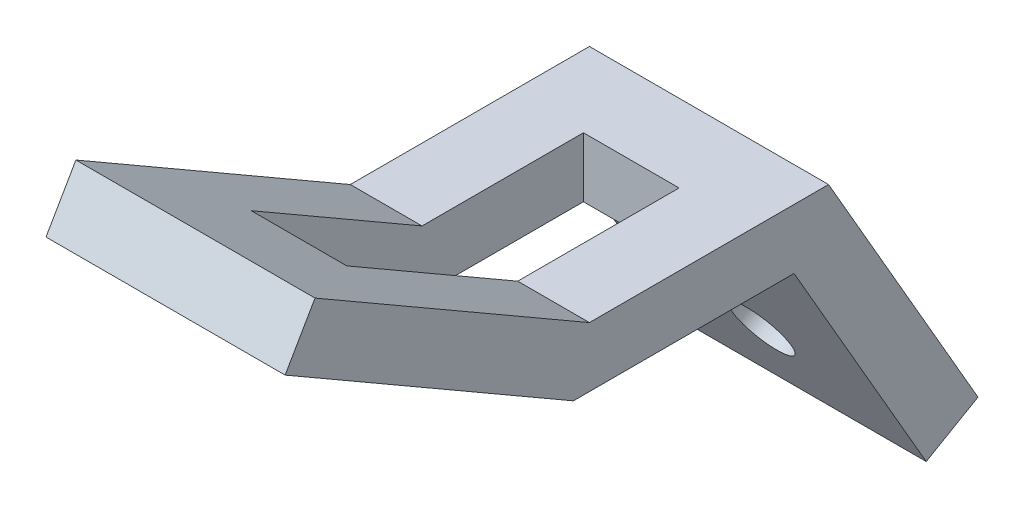
ISO-10303-21;
HEADER;
FILE_DESCRIPTION(('STEP AP214'),'2;1');
FILE_NAME('part.step','',(''),(''),'','','');
FILE_SCHEMA(('AUTOMOTIVE_DESIGN { 1 0 10303 214 1 1 1 1 }'));
ENDSEC;
DATA;
#1=APPLICATION_CONTEXT('core data for automotive mechanical design processes');
#2=APPLICATION_PROTOCOL_DEFINITION('international standard','automotive_design',2000,#1);
#3=PRODUCT_CONTEXT('',#1,'mechanical');
#4=PRODUCT('Part','Part','',(#3));
#5=PRODUCT_RELATED_PRODUCT_CATEGORY('part','',(#4));
#6=PRODUCT_DEFINITION_FORMATION('','',#4);
#7=PRODUCT_DEFINITION_CONTEXT('part definition',#1,'design');
#8=PRODUCT_DEFINITION('design','',#6,#7);
#9=PRODUCT_DEFINITION_SHAPE('','',#8);
#10=(LENGTH_UNIT() NAMED_UNIT(*) SI_UNIT(.MILLI.,.METRE.));
#11=(NAMED_UNIT(*) PLANE_ANGLE_UNIT() SI_UNIT($,.RADIAN.));
#12=(NAMED_UNIT(*) SI_UNIT($,.STERADIAN.) SOLID_ANGLE_UNIT());
#13=UNCERTAINTY_MEASURE_WITH_UNIT(LENGTH_MEASURE(1.E-05),#10,'distance_accuracy_value','');
#14=(GEOMETRIC_REPRESENTATION_CONTEXT(3) GLOBAL_UNCERTAINTY_ASSIGNED_CONTEXT((#13)) GLOBAL_UNIT_ASSIGNED_CONTEXT((#10,
#11,#12)) REPRESENTATION_CONTEXT('',''));
#15=CARTESIAN_POINT('',(0.,0.,0.));
#16=DIRECTION('',(0.,0.,1.));
#17=DIRECTION('',(1.,0.,0.));
#18=AXIS2_PLACEMENT_3D('',#15,#16,#17);
#19=CARTESIAN_POINT('',(40.,48.3012701892218,56.3397459621554));
#20=DIRECTION('',(0.,-0.866025403784438,0.500000000000001));
#21=DIRECTION('',(0.,-0.500000000000001,-0.866025403784438));
#22=AXIS2_PLACEMENT_3D('',#19,#20,#21);
#23=PLANE('',#22);
#24=DIRECTION('',(-1.,0.,0.));
#25=VECTOR('',#24,1.);
#26=CARTESIAN_POINT('',(40.,48.3012701892218,56.3397459621554));
#27=LINE('',#26,#25);
#28=CARTESIAN_POINT('',(40.,48.3012701892218,56.3397459621554));
#29=VERTEX_POINT('',#28);
#30=CARTESIAN_POINT('',(28.,48.3012701892218,56.3397459621554));
#31=VERTEX_POINT('',#30);
#32=EDGE_CURVE('E159',#29,#31,#27,.T.);
#33=ORIENTED_EDGE('',*,*,#32,.T.);
#34=DIRECTION('',(0.,-0.500000000000001,-0.866025403784438));
#35=VECTOR('',#34,1.);
#36=CARTESIAN_POINT('',(28.,48.3012701892218,56.3397459621554));
#37=LINE('',#36,#35);
#38=CARTESIAN_POINT('',(28.,64.8012701892218,84.9185842870419));
#39=VERTEX_POINT('',#38);
#40=EDGE_CURVE('E214',#39,#31,#37,.T.);
#41=ORIENTED_EDGE('',*,*,#40,.F.);
#42=DIRECTION('',(1.,0.,0.));
#43=VECTOR('',#42,1.);
#44=CARTESIAN_POINT('',(28.,64.8012701892218,84.9185842870419));
#45=LINE('',#44,#43);
#46=CARTESIAN_POINT('',(12.,64.8012701892218,84.9185842870419));
#47=VERTEX_POINT('',#46);
#48=EDGE_CURVE('E219',#47,#39,#45,.T.);
#49=ORIENTED_EDGE('',*,*,#48,.F.);
#50=DIRECTION('',(0.,0.500000000000001,0.866025403784438));
#51=VECTOR('',#50,1.);
#52=CARTESIAN_POINT('',(12.,64.8012701892218,84.9185842870419));
#53=LINE('',#52,#51);
#54=CARTESIAN_POINT('',(12.,48.3012701892218,56.3397459621554));
#55=VERTEX_POINT('',#54);
#56=EDGE_CURVE('E222',#55,#47,#53,.T.);
#57=ORIENTED_EDGE('',*,*,#56,.F.);
#58=CARTESIAN_POINT('',(0.,48.3012701892218,56.3397459621554));
#59=VERTEX_POINT('',#58);
#60=EDGE_CURVE('E90',#55,#59,#27,.T.);
#61=ORIENTED_EDGE('',*,*,#60,.T.);
#62=DIRECTION('',(0.,0.500000000000001,0.866025403784438));
#63=VECTOR('',#62,1.);
#64=CARTESIAN_POINT('',(0.,48.3012701892218,56.3397459621554));
#65=LINE('',#64,#63);
#66=CARTESIAN_POINT('',(0.,74.8012701892218,102.239092362731));
#67=VERTEX_POINT('',#66);
#68=EDGE_CURVE('E141',#59,#67,#65,.T.);
#69=ORIENTED_EDGE('',*,*,#68,.T.);
#70=DIRECTION('',(-1.,0.,0.));
#71=VECTOR('',#70,1.);
#72=CARTESIAN_POINT('',(40.,74.8012701892218,102.239092362731));
#73=LINE('',#72,#71);
#74=CARTESIAN_POINT('',(40.,74.8012701892218,102.239092362731));
#75=VERTEX_POINT('',#74);
#76=EDGE_CURVE('E11',#75,#67,#73,.T.);
#77=ORIENTED_EDGE('',*,*,#76,.F.);
#78=DIRECTION('',(0.,0.500000000000001,0.866025403784438));
#79=VECTOR('',#78,1.);
#80=CARTESIAN_POINT('',(40.,48.3012701892218,56.3397459621554));
#81=LINE('',#80,#79);
#82=EDGE_CURVE('E158',#29,#75,#81,.T.);
#83=ORIENTED_EDGE('',*,*,#82,.F.);
#84=EDGE_LOOP('',(#33,#41,#49,#57,#61,#69,#77,#83));
#85=FACE_BOUND('',#84,.T.);
#86=ADVANCED_FACE('F33',(#85),#23,.F.);
#87=CARTESIAN_POINT('',(40.,74.8012701892218,102.239092362731));
#88=DIRECTION('',(0.,-0.500000000000014,-0.86602540378443));
#89=DIRECTION('',(0.,0.86602540378443,-0.500000000000014));
#90=AXIS2_PLACEMENT_3D('',#87,#88,#89);
#91=PLANE('',#90);
#92=DIRECTION('',(0.,-0.86602540378443,0.500000000000014));
#93=VECTOR('',#92,1.);
#94=CARTESIAN_POINT('',(0.,74.8012701892218,102.239092362731));
#95=LINE('',#94,#93);
#96=CARTESIAN_POINT('',(0.,66.1410161513776,107.239092362731));
#97=VERTEX_POINT('',#96);
#98=EDGE_CURVE('E143',#67,#97,#95,.T.);
#99=ORIENTED_EDGE('',*,*,#98,.T.);
#100=DIRECTION('',(-1.,0.,0.));
#101=VECTOR('',#100,1.);
#102=CARTESIAN_POINT('',(40.,66.1410161513776,107.239092362731));
#103=LINE('',#102,#101);
#104=CARTESIAN_POINT('',(40.,66.1410161513776,107.239092362731));
#105=VERTEX_POINT('',#104);
#106=EDGE_CURVE('E40',#105,#97,#103,.T.);
#107=ORIENTED_EDGE('',*,*,#106,.F.);
#108=DIRECTION('',(0.,-0.86602540378443,0.500000000000014));
#109=VECTOR('',#108,1.);
#110=CARTESIAN_POINT('',(40.,74.8012701892218,102.239092362731));
#111=LINE('',#110,#109);
#112=EDGE_CURVE('E98',#75,#105,#111,.T.);
#113=ORIENTED_EDGE('',*,*,#112,.F.);
#114=ORIENTED_EDGE('',*,*,#76,.T.);
#115=EDGE_LOOP('',(#99,#107,#113,#114));
#116=FACE_BOUND('',#115,.T.);
#117=ADVANCED_FACE('F292',(#116),#91,.F.);
#118=CARTESIAN_POINT('',(40.,66.1410161513776,107.239092362731));
#119=DIRECTION('',(0.,0.866025403784438,-0.500000000000001));
#120=DIRECTION('',(0.,0.500000000000001,0.866025403784438));
#121=AXIS2_PLACEMENT_3D('',#118,#119,#120);
#122=PLANE('',#121);
#123=DIRECTION('',(-1.,0.,0.));
#124=VECTOR('',#123,1.);
#125=CARTESIAN_POINT('',(40.,38.301270189222,59.0192378864668));
#126=LINE('',#125,#124);
#127=CARTESIAN_POINT('',(12.,38.301270189222,59.0192378864668));
#128=VERTEX_POINT('',#127);
#129=CARTESIAN_POINT('',(0.,38.301270189222,59.0192378864668));
#130=VERTEX_POINT('',#129);
#131=EDGE_CURVE('E167',#128,#130,#126,.T.);
#132=ORIENTED_EDGE('',*,*,#131,.F.);
#133=DIRECTION('',(0.,-0.500000000000001,-0.866025403784438));
#134=VECTOR('',#133,1.);
#135=CARTESIAN_POINT('',(12.,56.1410161513775,89.9185842870418));
#136=LINE('',#135,#134);
#137=CARTESIAN_POINT('',(12.,56.1410161513775,89.9185842870419));
#138=VERTEX_POINT('',#137);
#139=EDGE_CURVE('E204',#138,#128,#136,.T.);
#140=ORIENTED_EDGE('',*,*,#139,.F.);
#141=DIRECTION('',(-1.,0.,0.));
#142=VECTOR('',#141,1.);
#143=CARTESIAN_POINT('',(28.,56.1410161513775,89.9185842870419));
#144=LINE('',#143,#142);
#145=CARTESIAN_POINT('',(28.,56.1410161513776,89.9185842870418));
#146=VERTEX_POINT('',#145);
#147=EDGE_CURVE('E47',#146,#138,#144,.T.);
#148=ORIENTED_EDGE('',*,*,#147,.F.);
#149=DIRECTION('',(0.,0.500000000000001,0.866025403784438));
#150=VECTOR('',#149,1.);
#151=CARTESIAN_POINT('',(28.,39.6410161513775,61.3397459621554));
#152=LINE('',#151,#150);
#153=CARTESIAN_POINT('',(28.,38.301270189222,59.0192378864668));
#154=VERTEX_POINT('',#153);
#155=EDGE_CURVE('E225',#154,#146,#152,.T.);
#156=ORIENTED_EDGE('',*,*,#155,.F.);
#157=CARTESIAN_POINT('',(40.,38.301270189222,59.0192378864668));
#158=VERTEX_POINT('',#157);
#159=EDGE_CURVE('E168',#158,#154,#126,.T.);
#160=ORIENTED_EDGE('',*,*,#159,.F.);
#161=DIRECTION('',(0.,-0.500000000000001,-0.866025403784438));
#162=VECTOR('',#161,1.);
#163=CARTESIAN_POINT('',(40.,66.1410161513776,107.239092362731));
#164=LINE('',#163,#162);
#165=EDGE_CURVE('E178',#105,#158,#164,.T.);
#166=ORIENTED_EDGE('',*,*,#165,.F.);
#167=ORIENTED_EDGE('',*,*,#106,.T.);
#168=DIRECTION('',(0.,-0.500000000000001,-0.866025403784438));
#169=VECTOR('',#168,1.);
#170=CARTESIAN_POINT('',(0.,66.1410161513776,107.239092362731));
#171=LINE('',#170,#169);
#172=EDGE_CURVE('E146',#97,#130,#171,.T.);
#173=ORIENTED_EDGE('',*,*,#172,.T.);
#174=EDGE_LOOP('',(#132,#140,#148,#156,#160,#166,#167,#173));
#175=FACE_BOUND('',#174,.T.);
#176=ADVANCED_FACE('F175',(#175),#122,.F.);
#177=CARTESIAN_POINT('',(40.,38.301270189222,59.0192378864668));
#178=DIRECTION('',(0.,1.,0.));
#179=DIRECTION('',(0.,0.,1.));
#180=AXIS2_PLACEMENT_3D('',#177,#178,#179);
#181=PLANE('',#180);
#182=DIRECTION('',(-1.,0.,0.));
#183=VECTOR('',#182,1.);
#184=CARTESIAN_POINT('',(40.,38.3012701892218,29.3397459621554));
#185=LINE('',#184,#183);
#186=CARTESIAN_POINT('',(28.,38.3012701892219,29.3397459621554));
#187=VERTEX_POINT('',#186);
#188=CARTESIAN_POINT('',(12.,38.3012701892218,29.3397459621554));
#189=VERTEX_POINT('',#188);
#190=EDGE_CURVE('E229',#187,#189,#185,.T.);
#191=ORIENTED_EDGE('',*,*,#190,.T.);
#192=DIRECTION('',(0.,0.,1.));
#193=VECTOR('',#192,1.);
#194=CARTESIAN_POINT('',(12.,38.301270189222,59.0192378864668));
#195=LINE('',#194,#193);
#196=EDGE_CURVE('E231',#189,#128,#195,.T.);
#197=ORIENTED_EDGE('',*,*,#196,.T.);
#198=ORIENTED_EDGE('',*,*,#131,.T.);
#199=DIRECTION('',(0.,0.,-1.));
#200=VECTOR('',#199,1.);
#201=CARTESIAN_POINT('',(0.,38.301270189222,59.0192378864668));
#202=LINE('',#201,#200);
#203=CARTESIAN_POINT('',(0.,38.3012701892218,22.1132486540517));
#204=VERTEX_POINT('',#203);
#205=EDGE_CURVE('E149',#130,#204,#202,.T.);
#206=ORIENTED_EDGE('',*,*,#205,.T.);
#207=DIRECTION('',(-1.,0.,0.));
#208=VECTOR('',#207,1.);
#209=CARTESIAN_POINT('',(40.,38.3012701892218,22.1132486540517));
#210=LINE('',#209,#208);
#211=CARTESIAN_POINT('',(40.,38.3012701892218,22.1132486540517));
#212=VERTEX_POINT('',#211);
#213=EDGE_CURVE('E164',#212,#204,#210,.T.);
#214=ORIENTED_EDGE('',*,*,#213,.F.);
#215=DIRECTION('',(0.,0.,-1.));
#216=VECTOR('',#215,1.);
#217=CARTESIAN_POINT('',(40.,38.301270189222,59.0192378864668));
#218=LINE('',#217,#216);
#219=EDGE_CURVE('E191',#158,#212,#218,.T.);
#220=ORIENTED_EDGE('',*,*,#219,.F.);
#221=ORIENTED_EDGE('',*,*,#159,.T.);
#222=DIRECTION('',(0.,0.,-1.));
#223=VECTOR('',#222,1.);
#224=CARTESIAN_POINT('',(28.,38.301270189222,59.0192378864668));
#225=LINE('',#224,#223);
#226=EDGE_CURVE('E233',#154,#187,#225,.T.);
#227=ORIENTED_EDGE('',*,*,#226,.T.);
#228=EDGE_LOOP('',(#191,#197,#198,#206,#214,#220,#221,#227));
#229=FACE_BOUND('',#228,.T.);
#230=ADVANCED_FACE('F186',(#229),#181,.F.);
#231=CARTESIAN_POINT('',(40.,38.3012701892218,22.1132486540517));
#232=DIRECTION('',(0.,0.499999999999998,-0.86602540378444));
#233=DIRECTION('',(0.,0.86602540378444,0.499999999999998));
#234=AXIS2_PLACEMENT_3D('',#231,#232,#233);
#235=PLANE('',#234);
#236=CARTESIAN_POINT('',(20.,30.3108891324552,17.4999999999998));
#237=DIRECTION('',(0.,0.499999999999998,-0.86602540378444));
#238=DIRECTION('',(0.,0.86602540378444,0.499999999999998));
#239=AXIS2_PLACEMENT_3D('',#236,#237,#238);
#240=CIRCLE('',#239,5.);
#241=CARTESIAN_POINT('',(20.,34.6410161513774,19.9999999999998));
#242=VERTEX_POINT('',#241);
#243=EDGE_CURVE('E144',#242,#242,#240,.F.);
#244=ORIENTED_EDGE('',*,*,#243,.F.);
#245=EDGE_LOOP('',(#244));
#246=FACE_BOUND('',#245,.T.);
#247=CARTESIAN_POINT('',(20.,12.9903810567664,7.49999999999988));
#248=DIRECTION('',(0.,0.499999999999998,-0.86602540378444));
#249=DIRECTION('',(0.,0.86602540378444,0.499999999999998));
#250=AXIS2_PLACEMENT_3D('',#247,#248,#249);
#251=CIRCLE('',#250,5.);
#252=CARTESIAN_POINT('',(20.,17.3205080756886,9.99999999999987));
#253=VERTEX_POINT('',#252);
#254=EDGE_CURVE('E197',#253,#253,#251,.F.);
#255=ORIENTED_EDGE('',*,*,#254,.F.);
#256=EDGE_LOOP('',(#255));
#257=FACE_BOUND('',#256,.T.);
#258=DIRECTION('',(0.,-0.86602540378444,-0.499999999999998));
#259=VECTOR('',#258,1.);
#260=CARTESIAN_POINT('',(0.,38.3012701892218,22.1132486540517));
#261=LINE('',#260,#259);
#262=CARTESIAN_POINT('',(0.,0.,0.));
#263=VERTEX_POINT('',#262);
#264=EDGE_CURVE('E151',#204,#263,#261,.T.);
#265=ORIENTED_EDGE('',*,*,#264,.T.);
#266=DIRECTION('',(-1.,0.,0.));
#267=VECTOR('',#266,1.);
#268=CARTESIAN_POINT('',(40.,0.,0.));
#269=LINE('',#268,#267);
#270=CARTESIAN_POINT('',(40.,0.,0.));
#271=VERTEX_POINT('',#270);
#272=EDGE_CURVE('E132',#271,#263,#269,.T.);
#273=ORIENTED_EDGE('',*,*,#272,.F.);
#274=DIRECTION('',(0.,-0.86602540378444,-0.499999999999998));
#275=VECTOR('',#274,1.);
#276=CARTESIAN_POINT('',(40.,38.3012701892218,22.1132486540517));
#277=LINE('',#276,#275);
#278=EDGE_CURVE('E120',#212,#271,#277,.T.);
#279=ORIENTED_EDGE('',*,*,#278,.F.);
#280=ORIENTED_EDGE('',*,*,#213,.T.);
#281=EDGE_LOOP('',(#265,#273,#279,#280));
#282=FACE_BOUND('',#281,.T.);
#283=ADVANCED_FACE('F190',(#246,#257,#282),#235,.F.);
#284=CARTESIAN_POINT('',(40.,0.,0.));
#285=DIRECTION('',(0.,0.86602540378445,0.499999999999981));
#286=DIRECTION('',(0.,-0.499999999999981,0.86602540378445));
#287=AXIS2_PLACEMENT_3D('',#284,#285,#286);
#288=PLANE('',#287);
#289=DIRECTION('',(0.,0.499999999999981,-0.86602540378445));
#290=VECTOR('',#289,1.);
#291=CARTESIAN_POINT('',(0.,0.,0.));
#292=LINE('',#291,#290);
#293=CARTESIAN_POINT('',(0.,4.99999999999981,-8.6602540378445));
#294=VERTEX_POINT('',#293);
#295=EDGE_CURVE('E129',#263,#294,#292,.T.);
#296=ORIENTED_EDGE('',*,*,#295,.T.);
#297=DIRECTION('',(-1.,0.,0.));
#298=VECTOR('',#297,1.);
#299=CARTESIAN_POINT('',(40.,4.99999999999981,-8.6602540378445));
#300=LINE('',#299,#298);
#301=CARTESIAN_POINT('',(40.,4.99999999999981,-8.6602540378445));
#302=VERTEX_POINT('',#301);
#303=EDGE_CURVE('E126',#302,#294,#300,.T.);
#304=ORIENTED_EDGE('',*,*,#303,.F.);
#305=DIRECTION('',(0.,0.499999999999981,-0.86602540378445));
#306=VECTOR('',#305,1.);
#307=CARTESIAN_POINT('',(40.,0.,0.));
#308=LINE('',#307,#306);
#309=EDGE_CURVE('E113',#271,#302,#308,.T.);
#310=ORIENTED_EDGE('',*,*,#309,.F.);
#311=ORIENTED_EDGE('',*,*,#272,.T.);
#312=EDGE_LOOP('',(#296,#304,#310,#311));
#313=FACE_BOUND('',#312,.T.);
#314=ADVANCED_FACE('F127',(#313),#288,.F.);
#315=CARTESIAN_POINT('',(40.,4.99999999999981,-8.6602540378445));
#316=DIRECTION('',(0.,-0.499999999999998,0.86602540378444));
#317=DIRECTION('',(0.,-0.86602540378444,-0.499999999999998));
#318=AXIS2_PLACEMENT_3D('',#315,#316,#317);
#319=PLANE('',#318);
#320=CARTESIAN_POINT('',(20.,35.3108891324552,8.83974596215545));
#321=DIRECTION('',(0.,0.499999999999998,-0.86602540378444));
#322=DIRECTION('',(0.,0.86602540378444,0.499999999999998));
#323=AXIS2_PLACEMENT_3D('',#320,#321,#322);
#324=CIRCLE('',#323,5.);
#325=CARTESIAN_POINT('',(20.,39.6410161513774,11.3397459621554));
#326=VERTEX_POINT('',#325);
#327=EDGE_CURVE('E200',#326,#326,#324,.T.);
#328=ORIENTED_EDGE('',*,*,#327,.F.);
#329=EDGE_LOOP('',(#328));
#330=FACE_BOUND('',#329,.T.);
#331=CARTESIAN_POINT('',(20.,17.9903810567664,-1.16025403784452));
#332=DIRECTION('',(0.,0.499999999999998,-0.86602540378444));
#333=DIRECTION('',(0.,0.86602540378444,0.499999999999998));
#334=AXIS2_PLACEMENT_3D('',#331,#332,#333);
#335=CIRCLE('',#334,5.);
#336=CARTESIAN_POINT('',(20.,22.3205080756886,1.33974596215547));
#337=VERTEX_POINT('',#336);
#338=EDGE_CURVE('E201',#337,#337,#335,.T.);
#339=ORIENTED_EDGE('',*,*,#338,.F.);
#340=EDGE_LOOP('',(#339));
#341=FACE_BOUND('',#340,.T.);
#342=DIRECTION('',(0.,0.86602540378444,0.499999999999998));
#343=VECTOR('',#342,1.);
#344=CARTESIAN_POINT('',(0.,4.99999999999981,-8.6602540378445));
#345=LINE('',#344,#343);
#346=CARTESIAN_POINT('',(0.,48.3012701892218,16.3397459621554));
#347=VERTEX_POINT('',#346);
#348=EDGE_CURVE('E154',#294,#347,#345,.T.);
#349=ORIENTED_EDGE('',*,*,#348,.T.);
#350=DIRECTION('',(-1.,0.,0.));
#351=VECTOR('',#350,1.);
#352=CARTESIAN_POINT('',(40.,48.3012701892218,16.3397459621554));
#353=LINE('',#352,#351);
#354=CARTESIAN_POINT('',(40.,48.3012701892218,16.3397459621554));
#355=VERTEX_POINT('',#354);
#356=EDGE_CURVE('E133',#355,#347,#353,.T.);
#357=ORIENTED_EDGE('',*,*,#356,.F.);
#358=DIRECTION('',(0.,0.86602540378444,0.499999999999998));
#359=VECTOR('',#358,1.);
#360=CARTESIAN_POINT('',(40.,4.99999999999981,-8.6602540378445));
#361=LINE('',#360,#359);
#362=EDGE_CURVE('E117',#302,#355,#361,.T.);
#363=ORIENTED_EDGE('',*,*,#362,.F.);
#364=ORIENTED_EDGE('',*,*,#303,.T.);
#365=EDGE_LOOP('',(#349,#357,#363,#364));
#366=FACE_BOUND('',#365,.T.);
#367=ADVANCED_FACE('F135',(#330,#341,#366),#319,.F.);
#368=CARTESIAN_POINT('',(40.,48.3012701892218,16.3397459621554));
#369=DIRECTION('',(0.,-1.,0.));
#370=DIRECTION('',(0.,0.,-1.));
#371=AXIS2_PLACEMENT_3D('',#368,#369,#370);
#372=PLANE('',#371);
#373=ORIENTED_EDGE('',*,*,#60,.F.);
#374=DIRECTION('',(0.,0.,1.));
#375=VECTOR('',#374,1.);
#376=CARTESIAN_POINT('',(12.,48.3012701892218,29.3397459621554));
#377=LINE('',#376,#375);
#378=CARTESIAN_POINT('',(12.,48.3012701892218,29.3397459621554));
#379=VERTEX_POINT('',#378);
#380=EDGE_CURVE('E240',#379,#55,#377,.T.);
#381=ORIENTED_EDGE('',*,*,#380,.F.);
#382=DIRECTION('',(-1.,0.,0.));
#383=VECTOR('',#382,1.);
#384=CARTESIAN_POINT('',(28.,48.3012701892218,29.3397459621554));
#385=LINE('',#384,#383);
#386=CARTESIAN_POINT('',(28.,48.3012701892218,29.3397459621554));
#387=VERTEX_POINT('',#386);
#388=EDGE_CURVE('E245',#387,#379,#385,.T.);
#389=ORIENTED_EDGE('',*,*,#388,.F.);
#390=DIRECTION('',(0.,0.,-1.));
#391=VECTOR('',#390,1.);
#392=CARTESIAN_POINT('',(28.,48.3012701892218,61.3397459621554));
#393=LINE('',#392,#391);
#394=EDGE_CURVE('E248',#31,#387,#393,.T.);
#395=ORIENTED_EDGE('',*,*,#394,.F.);
#396=ORIENTED_EDGE('',*,*,#32,.F.);
#397=DIRECTION('',(0.,0.,1.));
#398=VECTOR('',#397,1.);
#399=CARTESIAN_POINT('',(40.,48.3012701892218,16.3397459621554));
#400=LINE('',#399,#398);
#401=EDGE_CURVE('E56',#355,#29,#400,.T.);
#402=ORIENTED_EDGE('',*,*,#401,.F.);
#403=ORIENTED_EDGE('',*,*,#356,.T.);
#404=DIRECTION('',(0.,0.,1.));
#405=VECTOR('',#404,1.);
#406=CARTESIAN_POINT('',(0.,48.3012701892218,16.3397459621554));
#407=LINE('',#406,#405);
#408=EDGE_CURVE('E156',#347,#59,#407,.T.);
#409=ORIENTED_EDGE('',*,*,#408,.T.);
#410=EDGE_LOOP('',(#373,#381,#389,#395,#396,#402,#403,#409));
#411=FACE_BOUND('',#410,.T.);
#412=ADVANCED_FACE('F264',(#411),#372,.F.);
#413=CARTESIAN_POINT('',(40.,0.,0.));
#414=DIRECTION('',(1.,0.,0.));
#415=DIRECTION('',(0.,0.,-1.));
#416=AXIS2_PLACEMENT_3D('',#413,#414,#415);
#417=PLANE('',#416);
#418=ORIENTED_EDGE('',*,*,#82,.T.);
#419=ORIENTED_EDGE('',*,*,#112,.T.);
#420=ORIENTED_EDGE('',*,*,#165,.T.);
#421=ORIENTED_EDGE('',*,*,#219,.T.);
#422=ORIENTED_EDGE('',*,*,#278,.T.);
#423=ORIENTED_EDGE('',*,*,#309,.T.);
#424=ORIENTED_EDGE('',*,*,#362,.T.);
#425=ORIENTED_EDGE('',*,*,#401,.T.);
#426=EDGE_LOOP('',(#418,#419,#420,#421,#422,#423,#424,#425));
#427=FACE_BOUND('',#426,.T.);
#428=ADVANCED_FACE('F115',(#427),#417,.T.);
#429=CARTESIAN_POINT('',(0.,0.,0.));
#430=DIRECTION('',(1.,0.,0.));
#431=DIRECTION('',(0.,0.,-1.));
#432=AXIS2_PLACEMENT_3D('',#429,#430,#431);
#433=PLANE('',#432);
#434=ORIENTED_EDGE('',*,*,#68,.F.);
#435=ORIENTED_EDGE('',*,*,#408,.F.);
#436=ORIENTED_EDGE('',*,*,#348,.F.);
#437=ORIENTED_EDGE('',*,*,#295,.F.);
#438=ORIENTED_EDGE('',*,*,#264,.F.);
#439=ORIENTED_EDGE('',*,*,#205,.F.);
#440=ORIENTED_EDGE('',*,*,#172,.F.);
#441=ORIENTED_EDGE('',*,*,#98,.F.);
#442=EDGE_LOOP('',(#434,#435,#436,#437,#438,#439,#440,#441));
#443=FACE_BOUND('',#442,.T.);
#444=ADVANCED_FACE('F181',(#443),#433,.F.);
#445=CARTESIAN_POINT('',(20.,-33.4461910883906,87.93050228475));
#446=DIRECTION('',(0.,0.499999999999998,-0.86602540378444));
#447=DIRECTION('',(0.,0.86602540378444,0.499999999999998));
#448=AXIS2_PLACEMENT_3D('',#445,#446,#447);
#449=CYLINDRICAL_SURFACE('',#448,5.);
#450=ORIENTED_EDGE('',*,*,#338,.T.);
#451=EDGE_LOOP('',(#450));
#452=FACE_BOUND('',#451,.T.);
#453=ORIENTED_EDGE('',*,*,#254,.T.);
#454=EDGE_LOOP('',(#453));
#455=FACE_BOUND('',#454,.T.);
#456=ADVANCED_FACE('F314',(#452,#455),#449,.F.);
#457=CARTESIAN_POINT('',(20.,-16.1256830127019,97.9305022847499));
#458=DIRECTION('',(0.,0.499999999999998,-0.86602540378444));
#459=DIRECTION('',(0.,0.86602540378444,0.499999999999998));
#460=AXIS2_PLACEMENT_3D('',#457,#458,#459);
#461=CYLINDRICAL_SURFACE('',#460,5.);
#462=ORIENTED_EDGE('',*,*,#327,.T.);
#463=EDGE_LOOP('',(#462));
#464=FACE_BOUND('',#463,.T.);
#465=ORIENTED_EDGE('',*,*,#243,.T.);
#466=EDGE_LOOP('',(#465));
#467=FACE_BOUND('',#466,.T.);
#468=ADVANCED_FACE('F319',(#464,#467),#461,.F.);
#469=CARTESIAN_POINT('',(28.,-9.96592897485758,89.9803290844623));
#470=DIRECTION('',(1.,0.,0.));
#471=DIRECTION('',(0.,0.,-1.));
#472=AXIS2_PLACEMENT_3D('',#469,#470,#471);
#473=PLANE('',#472);
#474=ORIENTED_EDGE('',*,*,#40,.T.);
#475=ORIENTED_EDGE('',*,*,#394,.T.);
#476=DIRECTION('',(0.,1.,0.));
#477=VECTOR('',#476,1.);
#478=CARTESIAN_POINT('',(28.,8.3012701892218,29.3397459621554));
#479=LINE('',#478,#477);
#480=EDGE_CURVE('E237',#187,#387,#479,.T.);
#481=ORIENTED_EDGE('',*,*,#480,.F.);
#482=ORIENTED_EDGE('',*,*,#226,.F.);
#483=ORIENTED_EDGE('',*,*,#155,.T.);
#484=DIRECTION('',(0.,0.866025403784438,-0.500000000000001));
#485=VECTOR('',#484,1.);
#486=CARTESIAN_POINT('',(28.,6.53407102514246,118.559167409349));
#487=LINE('',#486,#485);
#488=EDGE_CURVE('E211',#146,#39,#487,.T.);
#489=ORIENTED_EDGE('',*,*,#488,.T.);
#490=EDGE_LOOP('',(#474,#475,#481,#482,#483,#489));
#491=FACE_BOUND('',#490,.T.);
#492=ADVANCED_FACE('F255',(#491),#473,.F.);
#493=CARTESIAN_POINT('',(28.,6.53407102514246,118.559167409349));
#494=DIRECTION('',(0.,0.500000000000001,0.866025403784438));
#495=DIRECTION('',(0.,-0.866025403784438,0.500000000000001));
#496=AXIS2_PLACEMENT_3D('',#493,#494,#495);
#497=PLANE('',#496);
#498=ORIENTED_EDGE('',*,*,#147,.T.);
#499=DIRECTION('',(0.,0.866025403784438,-0.500000000000001));
#500=VECTOR('',#499,1.);
#501=CARTESIAN_POINT('',(12.,6.53407102514246,118.559167409349));
#502=LINE('',#501,#500);
#503=EDGE_CURVE('E212',#138,#47,#502,.T.);
#504=ORIENTED_EDGE('',*,*,#503,.T.);
#505=ORIENTED_EDGE('',*,*,#48,.T.);
#506=ORIENTED_EDGE('',*,*,#488,.F.);
#507=EDGE_LOOP('',(#498,#504,#505,#506));
#508=FACE_BOUND('',#507,.T.);
#509=ADVANCED_FACE('F286',(#508),#497,.F.);
#510=CARTESIAN_POINT('',(12.,6.53407102514246,118.559167409349));
#511=DIRECTION('',(-1.,0.,0.));
#512=DIRECTION('',(0.,0.,1.));
#513=AXIS2_PLACEMENT_3D('',#510,#511,#512);
#514=PLANE('',#513);
#515=ORIENTED_EDGE('',*,*,#139,.T.);
#516=ORIENTED_EDGE('',*,*,#196,.F.);
#517=DIRECTION('',(0.,1.,0.));
#518=VECTOR('',#517,1.);
#519=CARTESIAN_POINT('',(12.,8.3012701892218,29.3397459621554));
#520=LINE('',#519,#518);
#521=EDGE_CURVE('E236',#189,#379,#520,.T.);
#522=ORIENTED_EDGE('',*,*,#521,.T.);
#523=ORIENTED_EDGE('',*,*,#380,.T.);
#524=ORIENTED_EDGE('',*,*,#56,.T.);
#525=ORIENTED_EDGE('',*,*,#503,.F.);
#526=EDGE_LOOP('',(#515,#516,#522,#523,#524,#525));
#527=FACE_BOUND('',#526,.T.);
#528=ADVANCED_FACE('F289',(#527),#514,.F.);
#529=CARTESIAN_POINT('',(28.,8.3012701892218,29.3397459621554));
#530=DIRECTION('',(0.,0.,-1.));
#531=DIRECTION('',(0.,1.,0.));
#532=AXIS2_PLACEMENT_3D('',#529,#530,#531);
#533=PLANE('',#532);
#534=ORIENTED_EDGE('',*,*,#480,.T.);
#535=ORIENTED_EDGE('',*,*,#388,.T.);
#536=ORIENTED_EDGE('',*,*,#521,.F.);
#537=ORIENTED_EDGE('',*,*,#190,.F.);
#538=EDGE_LOOP('',(#534,#535,#536,#537));
#539=FACE_BOUND('',#538,.T.);
#540=ADVANCED_FACE('F267',(#539),#533,.F.);
#541=CLOSED_SHELL('',(#86,#117,#176,#230,#283,#314,#367,#412,#428,#444,#456,#468,#492,#509,#528,#540));
#542=MANIFOLD_SOLID_BREP('B2',#541);
#543=ADVANCED_BREP_SHAPE_REPRESENTATION('',(#18,#542),#14);
#544=SHAPE_DEFINITION_REPRESENTATION(#9,#543);
ENDSEC;
END-ISO-10303-21;
